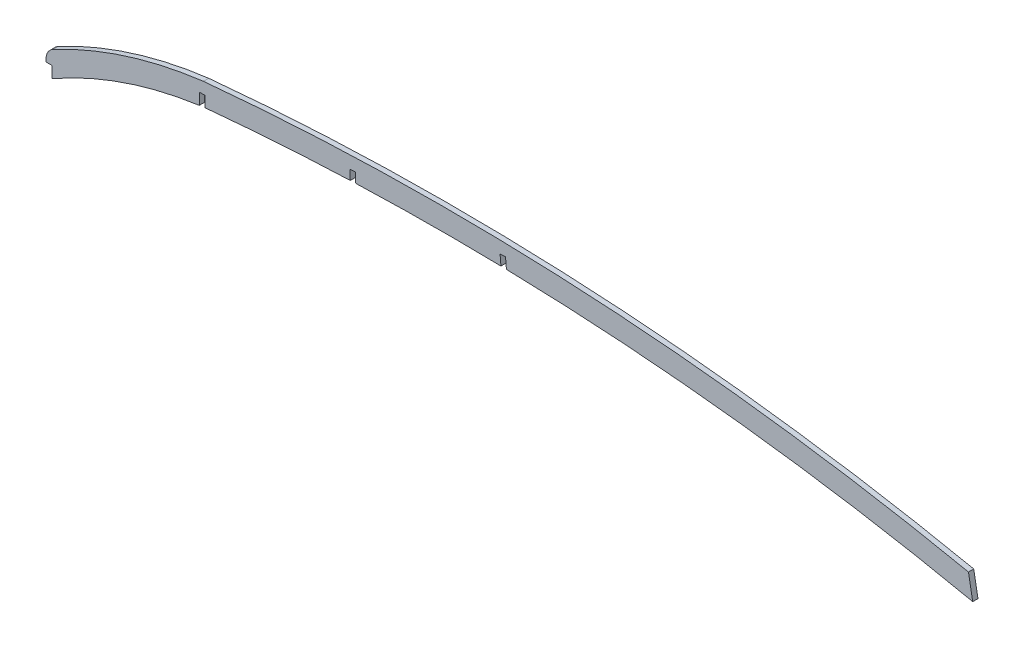
ISO-10303-21;
HEADER;
FILE_DESCRIPTION(('STEP AP214'),'2;1');
FILE_NAME('part.step','',(''),(''),'','','');
FILE_SCHEMA(('AUTOMOTIVE_DESIGN { 1 0 10303 214 1 1 1 1 }'));
ENDSEC;
DATA;
#1=APPLICATION_CONTEXT('core data for automotive mechanical design processes');
#2=APPLICATION_PROTOCOL_DEFINITION('international standard','automotive_design',2000,#1);
#3=PRODUCT_CONTEXT('',#1,'mechanical');
#4=PRODUCT('Part','Part','',(#3));
#5=PRODUCT_RELATED_PRODUCT_CATEGORY('part','',(#4));
#6=PRODUCT_DEFINITION_FORMATION('','',#4);
#7=PRODUCT_DEFINITION_CONTEXT('part definition',#1,'design');
#8=PRODUCT_DEFINITION('design','',#6,#7);
#9=PRODUCT_DEFINITION_SHAPE('','',#8);
#10=(LENGTH_UNIT() NAMED_UNIT(*) SI_UNIT(.MILLI.,.METRE.));
#11=(NAMED_UNIT(*) PLANE_ANGLE_UNIT() SI_UNIT($,.RADIAN.));
#12=(NAMED_UNIT(*) SI_UNIT($,.STERADIAN.) SOLID_ANGLE_UNIT());
#13=UNCERTAINTY_MEASURE_WITH_UNIT(LENGTH_MEASURE(1.E-05),#10,'distance_accuracy_value','');
#14=(GEOMETRIC_REPRESENTATION_CONTEXT(3) GLOBAL_UNCERTAINTY_ASSIGNED_CONTEXT((#13)) GLOBAL_UNIT_ASSIGNED_CONTEXT((#10,
#11,#12)) REPRESENTATION_CONTEXT('',''));
#15=CARTESIAN_POINT('',(0.,0.,0.));
#16=DIRECTION('',(0.,0.,1.));
#17=DIRECTION('',(1.,0.,0.));
#18=AXIS2_PLACEMENT_3D('',#15,#16,#17);
#19=CARTESIAN_POINT('',(286.464536041429,24.6588029549884,1.5875));
#20=DIRECTION('',(-0.996315598834546,-0.0857626230881483,0.));
#21=DIRECTION('',(0.0857626230881483,-0.996315598834546,0.));
#22=AXIS2_PLACEMENT_3D('',#19,#20,#21);
#23=PLANE('',#22);
#24=DIRECTION('',(-0.0857626230881483,0.996315598834546,0.));
#25=VECTOR('',#24,1.);
#26=CARTESIAN_POINT('',(286.464536041429,24.6588029549884,-1.5875));
#27=LINE('',#26,#25);
#28=CARTESIAN_POINT('',(277.352525483577,130.514220252583,-1.5875));
#29=VERTEX_POINT('',#28);
#30=CARTESIAN_POINT('',(276.807932826968,136.840824305182,-1.5875));
#31=VERTEX_POINT('',#30);
#32=EDGE_CURVE('E209',#29,#31,#27,.T.);
#33=ORIENTED_EDGE('',*,*,#32,.F.);
#34=DIRECTION('',(0.,0.,-1.));
#35=VECTOR('',#34,1.);
#36=CARTESIAN_POINT('',(277.352525483577,130.514220252583,1.5875));
#37=LINE('',#36,#35);
#38=CARTESIAN_POINT('',(277.352525483577,130.514220252583,1.5875));
#39=VERTEX_POINT('',#38);
#40=EDGE_CURVE('E11',#39,#29,#37,.T.);
#41=ORIENTED_EDGE('',*,*,#40,.F.);
#42=DIRECTION('',(-0.0857626230881483,0.996315598834546,0.));
#43=VECTOR('',#42,1.);
#44=CARTESIAN_POINT('',(286.464536041429,24.6588029549884,1.5875));
#45=LINE('',#44,#43);
#46=CARTESIAN_POINT('',(276.807932826968,136.840824305182,1.5875));
#47=VERTEX_POINT('',#46);
#48=EDGE_CURVE('E260',#39,#47,#45,.T.);
#49=ORIENTED_EDGE('',*,*,#48,.T.);
#50=DIRECTION('',(0.,0.,-1.));
#51=VECTOR('',#50,1.);
#52=CARTESIAN_POINT('',(276.807932826968,136.840824305182,1.5875));
#53=LINE('',#52,#51);
#54=EDGE_CURVE('E129',#47,#31,#53,.T.);
#55=ORIENTED_EDGE('',*,*,#54,.T.);
#56=EDGE_LOOP('',(#33,#41,#49,#55));
#57=FACE_BOUND('',#56,.T.);
#58=ADVANCED_FACE('F39',(#57),#23,.T.);
#59=CARTESIAN_POINT('',(240.865156098643,-1397.,1.5875));
#60=DIRECTION('',(0.,0.,-1.));
#61=DIRECTION('',(-1.,0.,0.));
#62=AXIS2_PLACEMENT_3D('',#59,#60,#61);
#63=CYLINDRICAL_SURFACE('',#62,1527.94994067165);
#64=CARTESIAN_POINT('',(240.865156098643,-1397.,-1.5875));
#65=DIRECTION('',(0.,0.,1.));
#66=DIRECTION('',(1.,0.,0.));
#67=AXIS2_PLACEMENT_3D('',#64,#65,#66);
#68=CIRCLE('',#67,1527.94994067165);
#69=CARTESIAN_POINT('',(558.229469453389,97.627349477909,-1.5875));
#70=VERTEX_POINT('',#69);
#71=EDGE_CURVE('E212',#29,#70,#68,.F.);
#72=ORIENTED_EDGE('',*,*,#71,.T.);
#73=DIRECTION('',(0.,0.,-1.));
#74=VECTOR('',#73,1.);
#75=CARTESIAN_POINT('',(558.229469453389,97.627349477909,1.5875));
#76=LINE('',#75,#74);
#77=CARTESIAN_POINT('',(558.229469453389,97.627349477909,1.5875));
#78=VERTEX_POINT('',#77);
#79=EDGE_CURVE('E47',#78,#70,#76,.T.);
#80=ORIENTED_EDGE('',*,*,#79,.F.);
#81=CARTESIAN_POINT('',(240.865156098643,-1397.,1.5875));
#82=DIRECTION('',(0.,0.,1.));
#83=DIRECTION('',(1.,0.,0.));
#84=AXIS2_PLACEMENT_3D('',#81,#82,#83);
#85=CIRCLE('',#84,1527.94994067165);
#86=EDGE_CURVE('E325',#39,#78,#85,.F.);
#87=ORIENTED_EDGE('',*,*,#86,.F.);
#88=ORIENTED_EDGE('',*,*,#40,.T.);
#89=EDGE_LOOP('',(#72,#80,#87,#88));
#90=FACE_BOUND('',#89,.T.);
#91=ADVANCED_FACE('F363',(#90),#63,.F.);
#92=CARTESIAN_POINT('',(557.475105992367,101.76000314717,1.5875));
#93=DIRECTION('',(-0.983745163502586,-0.179570190413861,0.));
#94=DIRECTION('',(0.179570190413861,-0.983745163502586,0.));
#95=AXIS2_PLACEMENT_3D('',#92,#93,#94);
#96=PLANE('',#95);
#97=DIRECTION('',(-0.179570190413861,0.983745163502586,0.));
#98=VECTOR('',#97,1.);
#99=CARTESIAN_POINT('',(557.475105992367,101.76000314717,-1.5875));
#100=LINE('',#99,#98);
#101=CARTESIAN_POINT('',(555.638244478768,111.822940797691,-1.5875));
#102=VERTEX_POINT('',#101);
#103=EDGE_CURVE('E214',#70,#102,#100,.T.);
#104=ORIENTED_EDGE('',*,*,#103,.T.);
#105=DIRECTION('',(0.,0.,-1.));
#106=VECTOR('',#105,1.);
#107=CARTESIAN_POINT('',(555.638244478768,111.822940797691,1.5875));
#108=LINE('',#107,#106);
#109=CARTESIAN_POINT('',(555.638244478768,111.822940797691,1.5875));
#110=VERTEX_POINT('',#109);
#111=EDGE_CURVE('E298',#110,#102,#108,.T.);
#112=ORIENTED_EDGE('',*,*,#111,.F.);
#113=DIRECTION('',(-0.179570190413861,0.983745163502586,0.));
#114=VECTOR('',#113,1.);
#115=CARTESIAN_POINT('',(557.475105992367,101.76000314717,1.5875));
#116=LINE('',#115,#114);
#117=EDGE_CURVE('E306',#78,#110,#116,.T.);
#118=ORIENTED_EDGE('',*,*,#117,.F.);
#119=ORIENTED_EDGE('',*,*,#79,.T.);
#120=EDGE_LOOP('',(#104,#112,#118,#119));
#121=FACE_BOUND('',#120,.T.);
#122=ADVANCED_FACE('F304',(#121),#96,.F.);
#123=CARTESIAN_POINT('',(240.865156098643,-1397.,1.5875));
#124=DIRECTION('',(0.,0.,-1.));
#125=DIRECTION('',(-1.,0.,0.));
#126=AXIS2_PLACEMENT_3D('',#123,#124,#125);
#127=CYLINDRICAL_SURFACE('',#126,1541.30748517152);
#128=CARTESIAN_POINT('',(240.865156098643,-1397.,-1.5875));
#129=DIRECTION('',(0.,0.,1.));
#130=DIRECTION('',(1.,0.,0.));
#131=AXIS2_PLACEMENT_3D('',#128,#129,#130);
#132=CIRCLE('',#131,1541.30748517152);
#133=CARTESIAN_POINT('',(94.8544150257179,137.375973266361,-1.5875));
#134=VERTEX_POINT('',#133);
#135=EDGE_CURVE('E217',#134,#102,#132,.F.);
#136=ORIENTED_EDGE('',*,*,#135,.F.);
#137=DIRECTION('',(0.,0.,-1.));
#138=VECTOR('',#137,1.);
#139=CARTESIAN_POINT('',(94.8544150257179,137.375973266361,1.5875));
#140=LINE('',#139,#138);
#141=CARTESIAN_POINT('',(94.8544150257179,137.375973266361,1.5875));
#142=VERTEX_POINT('',#141);
#143=EDGE_CURVE('E296',#142,#134,#140,.T.);
#144=ORIENTED_EDGE('',*,*,#143,.F.);
#145=CARTESIAN_POINT('',(240.865156098643,-1397.,1.5875));
#146=DIRECTION('',(0.,0.,1.));
#147=DIRECTION('',(1.,0.,0.));
#148=AXIS2_PLACEMENT_3D('',#145,#146,#147);
#149=CIRCLE('',#148,1541.30748517152);
#150=EDGE_CURVE('E318',#142,#110,#149,.F.);
#151=ORIENTED_EDGE('',*,*,#150,.T.);
#152=ORIENTED_EDGE('',*,*,#111,.T.);
#153=EDGE_LOOP('',(#136,#144,#151,#152));
#154=FACE_BOUND('',#153,.T.);
#155=ADVANCED_FACE('F315',(#154),#127,.T.);
#156=CARTESIAN_POINT('',(127.,-121.92,1.5875));
#157=DIRECTION('',(0.,0.,-1.));
#158=DIRECTION('',(-1.,0.,0.));
#159=AXIS2_PLACEMENT_3D('',#156,#157,#158);
#160=CYLINDRICAL_SURFACE('',#159,261.280960625699);
#161=CARTESIAN_POINT('',(127.,-121.92,-1.5875));
#162=DIRECTION('',(0.,0.,1.));
#163=DIRECTION('',(1.,0.,0.));
#164=AXIS2_PLACEMENT_3D('',#161,#162,#163);
#165=CIRCLE('',#164,261.280960625699);
#166=CARTESIAN_POINT('',(4.30052162583751,108.75851740506,-1.5875));
#167=VERTEX_POINT('',#166);
#168=EDGE_CURVE('E220',#167,#134,#165,.F.);
#169=ORIENTED_EDGE('',*,*,#168,.F.);
#170=DIRECTION('',(0.,0.,-1.));
#171=VECTOR('',#170,1.);
#172=CARTESIAN_POINT('',(4.30052162583751,108.75851740506,1.5875));
#173=LINE('',#172,#171);
#174=CARTESIAN_POINT('',(4.30052162583751,108.75851740506,1.5875));
#175=VERTEX_POINT('',#174);
#176=EDGE_CURVE('E294',#175,#167,#173,.T.);
#177=ORIENTED_EDGE('',*,*,#176,.F.);
#178=CARTESIAN_POINT('',(127.,-121.92,1.5875));
#179=DIRECTION('',(0.,0.,1.));
#180=DIRECTION('',(1.,0.,0.));
#181=AXIS2_PLACEMENT_3D('',#178,#179,#180);
#182=CIRCLE('',#181,261.280960625699);
#183=EDGE_CURVE('E321',#175,#142,#182,.F.);
#184=ORIENTED_EDGE('',*,*,#183,.T.);
#185=ORIENTED_EDGE('',*,*,#143,.T.);
#186=EDGE_LOOP('',(#169,#177,#184,#185));
#187=FACE_BOUND('',#186,.T.);
#188=ADVANCED_FACE('F373',(#187),#160,.T.);
#189=CARTESIAN_POINT('',(8.10818590864052,101.6,1.5875));
#190=DIRECTION('',(0.,0.,-1.));
#191=DIRECTION('',(-1.,0.,0.));
#192=AXIS2_PLACEMENT_3D('',#189,#190,#191);
#193=CYLINDRICAL_SURFACE('',#192,8.10818590864053);
#194=CARTESIAN_POINT('',(8.10818590864052,101.6,-1.5875));
#195=DIRECTION('',(0.,0.,1.));
#196=DIRECTION('',(1.,0.,0.));
#197=AXIS2_PLACEMENT_3D('',#194,#195,#196);
#198=CIRCLE('',#197,8.10818590864053);
#199=CARTESIAN_POINT('',(0.,101.6,-1.5875));
#200=VERTEX_POINT('',#199);
#201=EDGE_CURVE('E223',#167,#200,#198,.T.);
#202=ORIENTED_EDGE('',*,*,#201,.T.);
#203=DIRECTION('',(0.,0.,-1.));
#204=VECTOR('',#203,1.);
#205=CARTESIAN_POINT('',(0.,101.6,1.5875));
#206=LINE('',#205,#204);
#207=CARTESIAN_POINT('',(0.,101.6,1.5875));
#208=VERTEX_POINT('',#207);
#209=EDGE_CURVE('E291',#208,#200,#206,.T.);
#210=ORIENTED_EDGE('',*,*,#209,.F.);
#211=CARTESIAN_POINT('',(8.10818590864052,101.6,1.5875));
#212=DIRECTION('',(0.,0.,1.));
#213=DIRECTION('',(1.,0.,0.));
#214=AXIS2_PLACEMENT_3D('',#211,#212,#213);
#215=CIRCLE('',#214,8.10818590864053);
#216=EDGE_CURVE('E323',#175,#208,#215,.T.);
#217=ORIENTED_EDGE('',*,*,#216,.F.);
#218=ORIENTED_EDGE('',*,*,#176,.T.);
#219=EDGE_LOOP('',(#202,#210,#217,#218));
#220=FACE_BOUND('',#219,.T.);
#221=ADVANCED_FACE('F376',(#220),#193,.T.);
#222=CARTESIAN_POINT('',(0.,0.,1.5875));
#223=DIRECTION('',(1.,0.,0.));
#224=DIRECTION('',(0.,1.,0.));
#225=AXIS2_PLACEMENT_3D('',#222,#223,#224);
#226=PLANE('',#225);
#227=DIRECTION('',(0.,-1.,0.));
#228=VECTOR('',#227,1.);
#229=CARTESIAN_POINT('',(0.,0.,-1.5875));
#230=LINE('',#229,#228);
#231=CARTESIAN_POINT('',(0.,100.055269774224,-1.5875));
#232=VERTEX_POINT('',#231);
#233=EDGE_CURVE('E225',#200,#232,#230,.T.);
#234=ORIENTED_EDGE('',*,*,#233,.T.);
#235=DIRECTION('',(0.,0.,-1.));
#236=VECTOR('',#235,1.);
#237=CARTESIAN_POINT('',(0.,100.055269774224,1.5875));
#238=LINE('',#237,#236);
#239=CARTESIAN_POINT('',(0.,100.055269774224,1.5875));
#240=VERTEX_POINT('',#239);
#241=EDGE_CURVE('E289',#240,#232,#238,.T.);
#242=ORIENTED_EDGE('',*,*,#241,.F.);
#243=DIRECTION('',(0.,-1.,0.));
#244=VECTOR('',#243,1.);
#245=CARTESIAN_POINT('',(0.,0.,1.5875));
#246=LINE('',#245,#244);
#247=EDGE_CURVE('E330',#208,#240,#246,.T.);
#248=ORIENTED_EDGE('',*,*,#247,.F.);
#249=ORIENTED_EDGE('',*,*,#209,.T.);
#250=EDGE_LOOP('',(#234,#242,#248,#249));
#251=FACE_BOUND('',#250,.T.);
#252=ADVANCED_FACE('F380',(#251),#226,.F.);
#253=CARTESIAN_POINT('',(0.,100.055269774224,1.5875));
#254=DIRECTION('',(0.,-1.,0.));
#255=DIRECTION('',(0.,0.,-1.));
#256=AXIS2_PLACEMENT_3D('',#253,#254,#255);
#257=PLANE('',#256);
#258=DIRECTION('',(-1.,0.,0.));
#259=VECTOR('',#258,1.);
#260=CARTESIAN_POINT('',(0.,100.055269774224,-1.5875));
#261=LINE('',#260,#259);
#262=CARTESIAN_POINT('',(3.74992694370224,100.055269774224,-1.5875));
#263=VERTEX_POINT('',#262);
#264=EDGE_CURVE('E228',#263,#232,#261,.T.);
#265=ORIENTED_EDGE('',*,*,#264,.F.);
#266=DIRECTION('',(0.,0.,-1.));
#267=VECTOR('',#266,1.);
#268=CARTESIAN_POINT('',(3.74992694370224,100.055269774224,1.5875));
#269=LINE('',#268,#267);
#270=CARTESIAN_POINT('',(3.74992694370224,100.055269774224,1.5875));
#271=VERTEX_POINT('',#270);
#272=EDGE_CURVE('E287',#271,#263,#269,.T.);
#273=ORIENTED_EDGE('',*,*,#272,.F.);
#274=DIRECTION('',(-1.,0.,0.));
#275=VECTOR('',#274,1.);
#276=CARTESIAN_POINT('',(0.,100.055269774224,1.5875));
#277=LINE('',#276,#275);
#278=EDGE_CURVE('E332',#271,#240,#277,.T.);
#279=ORIENTED_EDGE('',*,*,#278,.T.);
#280=ORIENTED_EDGE('',*,*,#241,.T.);
#281=EDGE_LOOP('',(#265,#273,#279,#280));
#282=FACE_BOUND('',#281,.T.);
#283=ADVANCED_FACE('F384',(#282),#257,.T.);
#284=CARTESIAN_POINT('',(3.74992694370225,0.,1.5875));
#285=DIRECTION('',(-1.,0.,0.));
#286=DIRECTION('',(0.,-1.,0.));
#287=AXIS2_PLACEMENT_3D('',#284,#285,#286);
#288=PLANE('',#287);
#289=DIRECTION('',(0.,1.,0.));
#290=VECTOR('',#289,1.);
#291=CARTESIAN_POINT('',(3.74992694370225,0.,-1.5875));
#292=LINE('',#291,#290);
#293=CARTESIAN_POINT('',(3.74992694370224,93.1972697742242,-1.5875));
#294=VERTEX_POINT('',#293);
#295=EDGE_CURVE('E231',#294,#263,#292,.T.);
#296=ORIENTED_EDGE('',*,*,#295,.F.);
#297=DIRECTION('',(0.,0.,-1.));
#298=VECTOR('',#297,1.);
#299=CARTESIAN_POINT('',(3.74992694370224,93.1972697742242,1.5875));
#300=LINE('',#299,#298);
#301=CARTESIAN_POINT('',(3.74992694370224,93.1972697742242,1.5875));
#302=VERTEX_POINT('',#301);
#303=EDGE_CURVE('E285',#302,#294,#300,.T.);
#304=ORIENTED_EDGE('',*,*,#303,.F.);
#305=DIRECTION('',(0.,1.,0.));
#306=VECTOR('',#305,1.);
#307=CARTESIAN_POINT('',(3.74992694370225,0.,1.5875));
#308=LINE('',#307,#306);
#309=EDGE_CURVE('E335',#302,#271,#308,.T.);
#310=ORIENTED_EDGE('',*,*,#309,.T.);
#311=ORIENTED_EDGE('',*,*,#272,.T.);
#312=EDGE_LOOP('',(#296,#304,#310,#311));
#313=FACE_BOUND('',#312,.T.);
#314=ADVANCED_FACE('F388',(#313),#288,.T.);
#315=CARTESIAN_POINT('',(127.,-121.92,1.5875));
#316=DIRECTION('',(0.,0.,-1.));
#317=DIRECTION('',(-1.,0.,0.));
#318=AXIS2_PLACEMENT_3D('',#315,#316,#317);
#319=CYLINDRICAL_SURFACE('',#318,247.923416125825);
#320=CARTESIAN_POINT('',(127.,-121.92,-1.5875));
#321=DIRECTION('',(0.,0.,1.));
#322=DIRECTION('',(1.,0.,0.));
#323=AXIS2_PLACEMENT_3D('',#320,#321,#322);
#324=CIRCLE('',#323,247.923416125825);
#325=CARTESIAN_POINT('',(92.3290000000009,123.567152459144,-1.5875));
#326=VERTEX_POINT('',#325);
#327=EDGE_CURVE('E234',#294,#326,#324,.F.);
#328=ORIENTED_EDGE('',*,*,#327,.T.);
#329=DIRECTION('',(0.,0.,-1.));
#330=VECTOR('',#329,1.);
#331=CARTESIAN_POINT('',(92.3290000000009,123.567152459144,1.5875));
#332=LINE('',#331,#330);
#333=CARTESIAN_POINT('',(92.3290000000009,123.567152459144,1.5875));
#334=VERTEX_POINT('',#333);
#335=EDGE_CURVE('E283',#334,#326,#332,.T.);
#336=ORIENTED_EDGE('',*,*,#335,.F.);
#337=CARTESIAN_POINT('',(127.,-121.92,1.5875));
#338=DIRECTION('',(0.,0.,1.));
#339=DIRECTION('',(1.,0.,0.));
#340=AXIS2_PLACEMENT_3D('',#337,#338,#339);
#341=CIRCLE('',#340,247.923416125825);
#342=EDGE_CURVE('E338',#302,#334,#341,.F.);
#343=ORIENTED_EDGE('',*,*,#342,.F.);
#344=ORIENTED_EDGE('',*,*,#303,.T.);
#345=EDGE_LOOP('',(#328,#336,#343,#344));
#346=FACE_BOUND('',#345,.T.);
#347=ADVANCED_FACE('F392',(#346),#319,.F.);
#348=CARTESIAN_POINT('',(92.3290000000009,0.,1.5875));
#349=DIRECTION('',(1.,0.,0.));
#350=DIRECTION('',(0.,0.,-1.));
#351=AXIS2_PLACEMENT_3D('',#348,#349,#350);
#352=PLANE('',#351);
#353=DIRECTION('',(0.,-1.,0.));
#354=VECTOR('',#353,1.);
#355=CARTESIAN_POINT('',(92.3290000000009,0.,-1.5875));
#356=LINE('',#355,#354);
#357=CARTESIAN_POINT('',(92.3290000000009,130.517973266361,-1.5875));
#358=VERTEX_POINT('',#357);
#359=EDGE_CURVE('E237',#358,#326,#356,.T.);
#360=ORIENTED_EDGE('',*,*,#359,.F.);
#361=DIRECTION('',(0.,0.,-1.));
#362=VECTOR('',#361,1.);
#363=CARTESIAN_POINT('',(92.3290000000009,130.517973266361,1.5875));
#364=LINE('',#363,#362);
#365=CARTESIAN_POINT('',(92.3290000000009,130.517973266361,1.5875));
#366=VERTEX_POINT('',#365);
#367=EDGE_CURVE('E281',#366,#358,#364,.T.);
#368=ORIENTED_EDGE('',*,*,#367,.F.);
#369=DIRECTION('',(0.,-1.,0.));
#370=VECTOR('',#369,1.);
#371=CARTESIAN_POINT('',(92.3290000000009,0.,1.5875));
#372=LINE('',#371,#370);
#373=EDGE_CURVE('E340',#366,#334,#372,.T.);
#374=ORIENTED_EDGE('',*,*,#373,.T.);
#375=ORIENTED_EDGE('',*,*,#335,.T.);
#376=EDGE_LOOP('',(#360,#368,#374,#375));
#377=FACE_BOUND('',#376,.T.);
#378=ADVANCED_FACE('F396',(#377),#352,.T.);
#379=CARTESIAN_POINT('',(0.,130.517973266361,1.5875));
#380=DIRECTION('',(0.,1.,0.));
#381=DIRECTION('',(0.,0.,1.));
#382=AXIS2_PLACEMENT_3D('',#379,#380,#381);
#383=PLANE('',#382);
#384=DIRECTION('',(1.,0.,0.));
#385=VECTOR('',#384,1.);
#386=CARTESIAN_POINT('',(0.,130.517973266361,-1.5875));
#387=LINE('',#386,#385);
#388=CARTESIAN_POINT('',(95.6310000000009,130.517973266361,-1.5875));
#389=VERTEX_POINT('',#388);
#390=EDGE_CURVE('E240',#358,#389,#387,.T.);
#391=ORIENTED_EDGE('',*,*,#390,.T.);
#392=DIRECTION('',(0.,0.,-1.));
#393=VECTOR('',#392,1.);
#394=CARTESIAN_POINT('',(95.6310000000009,130.517973266361,1.5875));
#395=LINE('',#394,#393);
#396=CARTESIAN_POINT('',(95.6310000000009,130.517973266361,1.5875));
#397=VERTEX_POINT('',#396);
#398=EDGE_CURVE('E278',#397,#389,#395,.T.);
#399=ORIENTED_EDGE('',*,*,#398,.F.);
#400=DIRECTION('',(1.,0.,0.));
#401=VECTOR('',#400,1.);
#402=CARTESIAN_POINT('',(0.,130.517973266361,1.5875));
#403=LINE('',#402,#401);
#404=EDGE_CURVE('E343',#366,#397,#403,.T.);
#405=ORIENTED_EDGE('',*,*,#404,.F.);
#406=ORIENTED_EDGE('',*,*,#367,.T.);
#407=EDGE_LOOP('',(#391,#399,#405,#406));
#408=FACE_BOUND('',#407,.T.);
#409=ADVANCED_FACE('F400',(#408),#383,.F.);
#410=CARTESIAN_POINT('',(95.6309999999995,-1.01977191666539E-12,1.5875));
#411=DIRECTION('',(1.,0.,0.));
#412=DIRECTION('',(0.,1.,0.));
#413=AXIS2_PLACEMENT_3D('',#410,#411,#412);
#414=PLANE('',#413);
#415=DIRECTION('',(0.,-1.,0.));
#416=VECTOR('',#415,1.);
#417=CARTESIAN_POINT('',(95.6309999999995,-1.01977191666539E-12,-1.5875));
#418=LINE('',#417,#416);
#419=CARTESIAN_POINT('',(95.6310000000009,124.010897006657,-1.5875));
#420=VERTEX_POINT('',#419);
#421=EDGE_CURVE('E242',#389,#420,#418,.T.);
#422=ORIENTED_EDGE('',*,*,#421,.T.);
#423=DIRECTION('',(0.,0.,-1.));
#424=VECTOR('',#423,1.);
#425=CARTESIAN_POINT('',(95.6310000000009,124.010897006657,1.5875));
#426=LINE('',#425,#424);
#427=CARTESIAN_POINT('',(95.6310000000009,124.010897006657,1.5875));
#428=VERTEX_POINT('',#427);
#429=EDGE_CURVE('E275',#428,#420,#426,.T.);
#430=ORIENTED_EDGE('',*,*,#429,.F.);
#431=DIRECTION('',(0.,-1.,0.));
#432=VECTOR('',#431,1.);
#433=CARTESIAN_POINT('',(95.6309999999995,-1.01977191666539E-12,1.5875));
#434=LINE('',#433,#432);
#435=EDGE_CURVE('E345',#397,#428,#434,.T.);
#436=ORIENTED_EDGE('',*,*,#435,.F.);
#437=ORIENTED_EDGE('',*,*,#398,.T.);
#438=EDGE_LOOP('',(#422,#430,#436,#437));
#439=FACE_BOUND('',#438,.T.);
#440=ADVANCED_FACE('F404',(#439),#414,.F.);
#441=CARTESIAN_POINT('',(127.,-121.92,1.5875));
#442=DIRECTION('',(0.,0.,-1.));
#443=DIRECTION('',(-1.,0.,0.));
#444=AXIS2_PLACEMENT_3D('',#441,#442,#443);
#445=CYLINDRICAL_SURFACE('',#444,247.923416125825);
#446=CARTESIAN_POINT('',(127.,-121.92,-1.5875));
#447=DIRECTION('',(0.,0.,1.));
#448=DIRECTION('',(1.,0.,0.));
#449=AXIS2_PLACEMENT_3D('',#446,#447,#448);
#450=CIRCLE('',#449,247.923416125825);
#451=CARTESIAN_POINT('',(96.3111688048359,124.096698423855,-1.5875));
#452=VERTEX_POINT('',#451);
#453=EDGE_CURVE('E244',#420,#452,#450,.F.);
#454=ORIENTED_EDGE('',*,*,#453,.T.);
#455=DIRECTION('',(0.,0.,-1.));
#456=VECTOR('',#455,1.);
#457=CARTESIAN_POINT('',(96.3111688048359,124.096698423855,1.5875));
#458=LINE('',#457,#456);
#459=CARTESIAN_POINT('',(96.3111688048359,124.096698423855,1.5875));
#460=VERTEX_POINT('',#459);
#461=EDGE_CURVE('E272',#460,#452,#458,.T.);
#462=ORIENTED_EDGE('',*,*,#461,.F.);
#463=CARTESIAN_POINT('',(127.,-121.92,1.5875));
#464=DIRECTION('',(0.,0.,1.));
#465=DIRECTION('',(1.,0.,0.));
#466=AXIS2_PLACEMENT_3D('',#463,#464,#465);
#467=CIRCLE('',#466,247.923416125825);
#468=EDGE_CURVE('E347',#428,#460,#467,.F.);
#469=ORIENTED_EDGE('',*,*,#468,.F.);
#470=ORIENTED_EDGE('',*,*,#429,.T.);
#471=EDGE_LOOP('',(#454,#462,#469,#470));
#472=FACE_BOUND('',#471,.T.);
#473=ADVANCED_FACE('F408',(#472),#445,.F.);
#474=CARTESIAN_POINT('',(240.865156098643,-1397.,1.5875));
#475=DIRECTION('',(0.,0.,-1.));
#476=DIRECTION('',(-1.,0.,0.));
#477=AXIS2_PLACEMENT_3D('',#474,#475,#476);
#478=CYLINDRICAL_SURFACE('',#477,1527.94994067165);
#479=CARTESIAN_POINT('',(240.865156098643,-1397.,-1.5875));
#480=DIRECTION('',(0.,0.,1.));
#481=DIRECTION('',(1.,0.,0.));
#482=AXIS2_PLACEMENT_3D('',#479,#480,#481);
#483=CIRCLE('',#482,1527.94994067165);
#484=CARTESIAN_POINT('',(183.29404286379,129.864954119842,-1.5875));
#485=VERTEX_POINT('',#484);
#486=EDGE_CURVE('E246',#452,#485,#483,.F.);
#487=ORIENTED_EDGE('',*,*,#486,.T.);
#488=DIRECTION('',(0.,0.,-1.));
#489=VECTOR('',#488,1.);
#490=CARTESIAN_POINT('',(183.29404286379,129.864954119842,1.5875));
#491=LINE('',#490,#489);
#492=CARTESIAN_POINT('',(183.29404286379,129.864954119842,1.5875));
#493=VERTEX_POINT('',#492);
#494=EDGE_CURVE('E269',#493,#485,#491,.T.);
#495=ORIENTED_EDGE('',*,*,#494,.F.);
#496=CARTESIAN_POINT('',(240.865156098643,-1397.,1.5875));
#497=DIRECTION('',(0.,0.,1.));
#498=DIRECTION('',(1.,0.,0.));
#499=AXIS2_PLACEMENT_3D('',#496,#497,#498);
#500=CIRCLE('',#499,1527.94994067165);
#501=EDGE_CURVE('E349',#460,#493,#500,.F.);
#502=ORIENTED_EDGE('',*,*,#501,.F.);
#503=ORIENTED_EDGE('',*,*,#461,.T.);
#504=EDGE_LOOP('',(#487,#495,#502,#503));
#505=FACE_BOUND('',#504,.T.);
#506=ADVANCED_FACE('F412',(#505),#478,.F.);
#507=CARTESIAN_POINT('',(188.401176463154,7.8883134788638,1.5875));
#508=DIRECTION('',(-0.999124612078613,-0.0418331153365471,0.));
#509=DIRECTION('',(0.0418331153365471,-0.999124612078613,0.));
#510=AXIS2_PLACEMENT_3D('',#507,#508,#509);
#511=PLANE('',#510);
#512=DIRECTION('',(-0.0418331153365471,0.999124612078613,0.));
#513=VECTOR('',#512,1.);
#514=CARTESIAN_POINT('',(188.401176463154,7.8883134788638,-1.5875));
#515=LINE('',#514,#513);
#516=CARTESIAN_POINT('',(183.050163268188,135.689672274095,-1.5875));
#517=VERTEX_POINT('',#516);
#518=EDGE_CURVE('E248',#485,#517,#515,.T.);
#519=ORIENTED_EDGE('',*,*,#518,.T.);
#520=DIRECTION('',(0.,0.,-1.));
#521=VECTOR('',#520,1.);
#522=CARTESIAN_POINT('',(183.050163268188,135.689672274095,1.5875));
#523=LINE('',#522,#521);
#524=CARTESIAN_POINT('',(183.050163268188,135.689672274095,1.5875));
#525=VERTEX_POINT('',#524);
#526=EDGE_CURVE('E266',#525,#517,#523,.T.);
#527=ORIENTED_EDGE('',*,*,#526,.F.);
#528=DIRECTION('',(-0.0418331153365471,0.999124612078613,0.));
#529=VECTOR('',#528,1.);
#530=CARTESIAN_POINT('',(188.401176463154,7.8883134788638,1.5875));
#531=LINE('',#530,#529);
#532=EDGE_CURVE('E351',#493,#525,#531,.T.);
#533=ORIENTED_EDGE('',*,*,#532,.F.);
#534=ORIENTED_EDGE('',*,*,#494,.T.);
#535=EDGE_LOOP('',(#519,#527,#533,#534));
#536=FACE_BOUND('',#535,.T.);
#537=ADVANCED_FACE('F416',(#536),#511,.F.);
#538=CARTESIAN_POINT('',(-5.35101319495962,127.801358795243,1.5875));
#539=DIRECTION('',(-0.0418331153364905,0.999124612078615,0.));
#540=DIRECTION('',(-0.999124612078615,-0.0418331153364905,0.));
#541=AXIS2_PLACEMENT_3D('',#538,#539,#540);
#542=PLANE('',#541);
#543=DIRECTION('',(0.999124612078615,0.0418331153364905,0.));
#544=VECTOR('',#543,1.);
#545=CARTESIAN_POINT('',(-5.35101319495962,127.801358795243,-1.5875));
#546=LINE('',#545,#544);
#547=CARTESIAN_POINT('',(186.349272737271,135.827805220936,-1.5875));
#548=VERTEX_POINT('',#547);
#549=EDGE_CURVE('E250',#517,#548,#546,.T.);
#550=ORIENTED_EDGE('',*,*,#549,.T.);
#551=DIRECTION('',(0.,0.,-1.));
#552=VECTOR('',#551,1.);
#553=CARTESIAN_POINT('',(186.349272737271,135.827805220936,1.5875));
#554=LINE('',#553,#552);
#555=CARTESIAN_POINT('',(186.349272737271,135.827805220936,1.5875));
#556=VERTEX_POINT('',#555);
#557=EDGE_CURVE('E264',#556,#548,#554,.T.);
#558=ORIENTED_EDGE('',*,*,#557,.F.);
#559=DIRECTION('',(0.999124612078615,0.0418331153364905,0.));
#560=VECTOR('',#559,1.);
#561=CARTESIAN_POINT('',(-5.35101319495962,127.801358795243,1.5875));
#562=LINE('',#561,#560);
#563=EDGE_CURVE('E353',#525,#556,#562,.T.);
#564=ORIENTED_EDGE('',*,*,#563,.F.);
#565=ORIENTED_EDGE('',*,*,#526,.T.);
#566=EDGE_LOOP('',(#550,#558,#564,#565));
#567=FACE_BOUND('',#566,.T.);
#568=ADVANCED_FACE('F420',(#567),#542,.F.);
#569=CARTESIAN_POINT('',(191.70028593224,8.02644642570929,1.5875));
#570=DIRECTION('',(-0.999124612078612,-0.0418331153365685,0.));
#571=DIRECTION('',(0.0418331153365685,-0.999124612078612,0.));
#572=AXIS2_PLACEMENT_3D('',#569,#570,#571);
#573=PLANE('',#572);
#574=DIRECTION('',(-0.0418331153365685,0.999124612078612,0.));
#575=VECTOR('',#574,1.);
#576=CARTESIAN_POINT('',(191.70028593224,8.02644642570929,-1.5875));
#577=LINE('',#576,#575);
#578=CARTESIAN_POINT('',(186.593875919739,129.985805220937,-1.5875));
#579=VERTEX_POINT('',#578);
#580=EDGE_CURVE('E253',#579,#548,#577,.T.);
#581=ORIENTED_EDGE('',*,*,#580,.F.);
#582=DIRECTION('',(0.,0.,-1.));
#583=VECTOR('',#582,1.);
#584=CARTESIAN_POINT('',(186.593875919739,129.985805220937,1.5875));
#585=LINE('',#584,#583);
#586=CARTESIAN_POINT('',(186.593875919739,129.985805220937,1.5875));
#587=VERTEX_POINT('',#586);
#588=EDGE_CURVE('E201',#587,#579,#585,.T.);
#589=ORIENTED_EDGE('',*,*,#588,.F.);
#590=DIRECTION('',(-0.0418331153365685,0.999124612078612,0.));
#591=VECTOR('',#590,1.);
#592=CARTESIAN_POINT('',(191.70028593224,8.02644642570929,1.5875));
#593=LINE('',#592,#591);
#594=EDGE_CURVE('E194',#587,#556,#593,.T.);
#595=ORIENTED_EDGE('',*,*,#594,.T.);
#596=ORIENTED_EDGE('',*,*,#557,.T.);
#597=EDGE_LOOP('',(#581,#589,#595,#596));
#598=FACE_BOUND('',#597,.T.);
#599=ADVANCED_FACE('F356',(#598),#573,.T.);
#600=CARTESIAN_POINT('',(240.865156098643,-1397.,1.5875));
#601=DIRECTION('',(0.,0.,-1.));
#602=DIRECTION('',(-1.,0.,0.));
#603=AXIS2_PLACEMENT_3D('',#600,#601,#602);
#604=CYLINDRICAL_SURFACE('',#603,1527.94994067165);
#605=CARTESIAN_POINT('',(240.865156098643,-1397.,-1.5875));
#606=DIRECTION('',(0.,0.,1.));
#607=DIRECTION('',(1.,0.,0.));
#608=AXIS2_PLACEMENT_3D('',#605,#606,#607);
#609=CIRCLE('',#608,1527.94994067165);
#610=CARTESIAN_POINT('',(274.031797498866,130.589930281265,-1.5875));
#611=VERTEX_POINT('',#610);
#612=EDGE_CURVE('E200',#579,#611,#609,.F.);
#613=ORIENTED_EDGE('',*,*,#612,.T.);
#614=DIRECTION('',(0.,0.,-1.));
#615=VECTOR('',#614,1.);
#616=CARTESIAN_POINT('',(274.031797498866,130.589930281265,1.5875));
#617=LINE('',#616,#615);
#618=CARTESIAN_POINT('',(274.031797498866,130.589930281265,1.5875));
#619=VERTEX_POINT('',#618);
#620=EDGE_CURVE('E197',#619,#611,#617,.T.);
#621=ORIENTED_EDGE('',*,*,#620,.F.);
#622=CARTESIAN_POINT('',(240.865156098643,-1397.,1.5875));
#623=DIRECTION('',(0.,0.,1.));
#624=DIRECTION('',(1.,0.,0.));
#625=AXIS2_PLACEMENT_3D('',#622,#623,#624);
#626=CIRCLE('',#625,1527.94994067165);
#627=EDGE_CURVE('E188',#587,#619,#626,.F.);
#628=ORIENTED_EDGE('',*,*,#627,.F.);
#629=ORIENTED_EDGE('',*,*,#588,.T.);
#630=EDGE_LOOP('',(#613,#621,#628,#629));
#631=FACE_BOUND('',#630,.T.);
#632=ADVANCED_FACE('F198',(#631),#604,.F.);
#633=CARTESIAN_POINT('',(283.174701934072,24.3756147735345,1.5875));
#634=DIRECTION('',(-0.996315598834551,-0.085762623088091,0.));
#635=DIRECTION('',(0.0857626230880911,-0.996315598834551,0.));
#636=AXIS2_PLACEMENT_3D('',#633,#634,#635);
#637=PLANE('',#636);
#638=DIRECTION('',(-0.0857626230880911,0.996315598834551,0.));
#639=VECTOR('',#638,1.);
#640=CARTESIAN_POINT('',(283.174701934072,24.3756147735345,-1.5875));
#641=LINE('',#640,#639);
#642=CARTESIAN_POINT('',(273.518098719616,136.557636123745,-1.5875));
#643=VERTEX_POINT('',#642);
#644=EDGE_CURVE('E122',#611,#643,#641,.T.);
#645=ORIENTED_EDGE('',*,*,#644,.T.);
#646=DIRECTION('',(0.,0.,-1.));
#647=VECTOR('',#646,1.);
#648=CARTESIAN_POINT('',(273.518098719616,136.557636123745,1.5875));
#649=LINE('',#648,#647);
#650=CARTESIAN_POINT('',(273.518098719616,136.557636123745,1.5875));
#651=VERTEX_POINT('',#650);
#652=EDGE_CURVE('E202',#651,#643,#649,.T.);
#653=ORIENTED_EDGE('',*,*,#652,.F.);
#654=DIRECTION('',(-0.0857626230880911,0.996315598834551,0.));
#655=VECTOR('',#654,1.);
#656=CARTESIAN_POINT('',(283.174701934072,24.3756147735345,1.5875));
#657=LINE('',#656,#655);
#658=EDGE_CURVE('E192',#619,#651,#657,.T.);
#659=ORIENTED_EDGE('',*,*,#658,.F.);
#660=ORIENTED_EDGE('',*,*,#620,.T.);
#661=EDGE_LOOP('',(#645,#653,#659,#660));
#662=FACE_BOUND('',#661,.T.);
#663=ADVANCED_FACE('F204',(#662),#637,.F.);
#664=CARTESIAN_POINT('',(-9.65660321445833,112.182021350203,1.5875));
#665=DIRECTION('',(-0.0857626230881184,0.996315598834549,0.));
#666=DIRECTION('',(-0.996315598834549,-0.0857626230881184,0.));
#667=AXIS2_PLACEMENT_3D('',#664,#665,#666);
#668=PLANE('',#667);
#669=DIRECTION('',(0.996315598834549,0.0857626230881184,0.));
#670=VECTOR('',#669,1.);
#671=CARTESIAN_POINT('',(-9.65660321445833,112.182021350203,-1.5875));
#672=LINE('',#671,#670);
#673=EDGE_CURVE('E258',#643,#31,#672,.T.);
#674=ORIENTED_EDGE('',*,*,#673,.T.);
#675=ORIENTED_EDGE('',*,*,#54,.F.);
#676=DIRECTION('',(0.996315598834549,0.0857626230881184,0.));
#677=VECTOR('',#676,1.);
#678=CARTESIAN_POINT('',(-9.65660321445833,112.182021350203,1.5875));
#679=LINE('',#678,#677);
#680=EDGE_CURVE('E55',#651,#47,#679,.T.);
#681=ORIENTED_EDGE('',*,*,#680,.F.);
#682=ORIENTED_EDGE('',*,*,#652,.T.);
#683=EDGE_LOOP('',(#674,#675,#681,#682));
#684=FACE_BOUND('',#683,.T.);
#685=ADVANCED_FACE('F361',(#684),#668,.F.);
#686=CARTESIAN_POINT('',(0.,0.,1.5875));
#687=DIRECTION('',(0.,0.,1.));
#688=DIRECTION('',(1.,0.,0.));
#689=AXIS2_PLACEMENT_3D('',#686,#687,#688);
#690=PLANE('',#689);
#691=ORIENTED_EDGE('',*,*,#48,.F.);
#692=ORIENTED_EDGE('',*,*,#86,.T.);
#693=ORIENTED_EDGE('',*,*,#117,.T.);
#694=ORIENTED_EDGE('',*,*,#150,.F.);
#695=ORIENTED_EDGE('',*,*,#183,.F.);
#696=ORIENTED_EDGE('',*,*,#216,.T.);
#697=ORIENTED_EDGE('',*,*,#247,.T.);
#698=ORIENTED_EDGE('',*,*,#278,.F.);
#699=ORIENTED_EDGE('',*,*,#309,.F.);
#700=ORIENTED_EDGE('',*,*,#342,.T.);
#701=ORIENTED_EDGE('',*,*,#373,.F.);
#702=ORIENTED_EDGE('',*,*,#404,.T.);
#703=ORIENTED_EDGE('',*,*,#435,.T.);
#704=ORIENTED_EDGE('',*,*,#468,.T.);
#705=ORIENTED_EDGE('',*,*,#501,.T.);
#706=ORIENTED_EDGE('',*,*,#532,.T.);
#707=ORIENTED_EDGE('',*,*,#563,.T.);
#708=ORIENTED_EDGE('',*,*,#594,.F.);
#709=ORIENTED_EDGE('',*,*,#627,.T.);
#710=ORIENTED_EDGE('',*,*,#658,.T.);
#711=ORIENTED_EDGE('',*,*,#680,.T.);
#712=EDGE_LOOP('',(#691,#692,#693,#694,#695,#696,#697,#698,#699,#700,#701,#702,#703,#704,#705,
#706,#707,#708,#709,#710,#711));
#713=FACE_BOUND('',#712,.T.);
#714=ADVANCED_FACE('F190',(#713),#690,.T.);
#715=CARTESIAN_POINT('',(0.,0.,-1.5875));
#716=DIRECTION('',(0.,0.,1.));
#717=DIRECTION('',(1.,0.,0.));
#718=AXIS2_PLACEMENT_3D('',#715,#716,#717);
#719=PLANE('',#718);
#720=ORIENTED_EDGE('',*,*,#32,.T.);
#721=ORIENTED_EDGE('',*,*,#673,.F.);
#722=ORIENTED_EDGE('',*,*,#644,.F.);
#723=ORIENTED_EDGE('',*,*,#612,.F.);
#724=ORIENTED_EDGE('',*,*,#580,.T.);
#725=ORIENTED_EDGE('',*,*,#549,.F.);
#726=ORIENTED_EDGE('',*,*,#518,.F.);
#727=ORIENTED_EDGE('',*,*,#486,.F.);
#728=ORIENTED_EDGE('',*,*,#453,.F.);
#729=ORIENTED_EDGE('',*,*,#421,.F.);
#730=ORIENTED_EDGE('',*,*,#390,.F.);
#731=ORIENTED_EDGE('',*,*,#359,.T.);
#732=ORIENTED_EDGE('',*,*,#327,.F.);
#733=ORIENTED_EDGE('',*,*,#295,.T.);
#734=ORIENTED_EDGE('',*,*,#264,.T.);
#735=ORIENTED_EDGE('',*,*,#233,.F.);
#736=ORIENTED_EDGE('',*,*,#201,.F.);
#737=ORIENTED_EDGE('',*,*,#168,.T.);
#738=ORIENTED_EDGE('',*,*,#135,.T.);
#739=ORIENTED_EDGE('',*,*,#103,.F.);
#740=ORIENTED_EDGE('',*,*,#71,.F.);
#741=EDGE_LOOP('',(#720,#721,#722,#723,#724,#725,#726,#727,#728,#729,#730,#731,#732,#733,#734,
#735,#736,#737,#738,#739,#740));
#742=FACE_BOUND('',#741,.T.);
#743=ADVANCED_FACE('F310',(#742),#719,.F.);
#744=CLOSED_SHELL('',(#58,#91,#122,#155,#188,#221,#252,#283,#314,#347,#378,#409,#440,#473,#506,
#537,#568,#599,#632,#663,#685,#714,#743));
#745=MANIFOLD_SOLID_BREP('B2',#744);
#746=ADVANCED_BREP_SHAPE_REPRESENTATION('',(#18,#745),#14);
#747=SHAPE_DEFINITION_REPRESENTATION(#9,#746);
ENDSEC;
END-ISO-10303-21;
